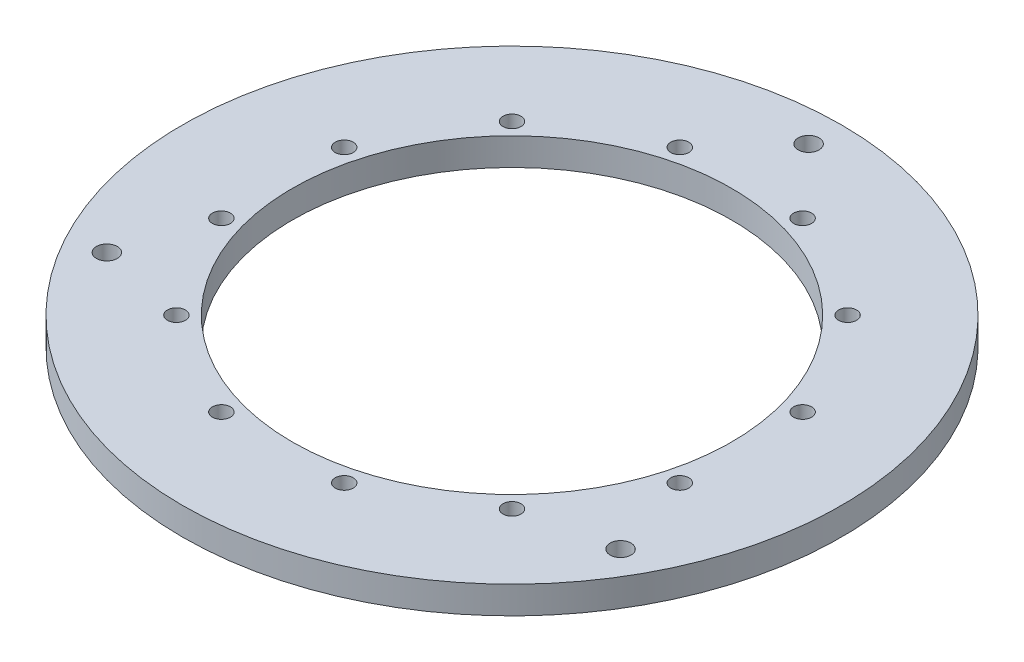
ISO-10303-21;
HEADER;
FILE_DESCRIPTION(('STEP AP214'),'2;1');
FILE_NAME('part.step','',(''),(''),'','','');
FILE_SCHEMA(('AUTOMOTIVE_DESIGN { 1 0 10303 214 1 1 1 1 }'));
ENDSEC;
DATA;
#1=APPLICATION_CONTEXT('core data for automotive mechanical design processes');
#2=APPLICATION_PROTOCOL_DEFINITION('international standard','automotive_design',2000,#1);
#3=PRODUCT_CONTEXT('',#1,'mechanical');
#4=PRODUCT('Part','Part','',(#3));
#5=PRODUCT_RELATED_PRODUCT_CATEGORY('part','',(#4));
#6=PRODUCT_DEFINITION_FORMATION('','',#4);
#7=PRODUCT_DEFINITION_CONTEXT('part definition',#1,'design');
#8=PRODUCT_DEFINITION('design','',#6,#7);
#9=PRODUCT_DEFINITION_SHAPE('','',#8);
#10=(LENGTH_UNIT() NAMED_UNIT(*) SI_UNIT(.MILLI.,.METRE.));
#11=(NAMED_UNIT(*) PLANE_ANGLE_UNIT() SI_UNIT($,.RADIAN.));
#12=(NAMED_UNIT(*) SI_UNIT($,.STERADIAN.) SOLID_ANGLE_UNIT());
#13=UNCERTAINTY_MEASURE_WITH_UNIT(LENGTH_MEASURE(1.E-05),#10,'distance_accuracy_value','');
#14=(GEOMETRIC_REPRESENTATION_CONTEXT(3) GLOBAL_UNCERTAINTY_ASSIGNED_CONTEXT((#13)) GLOBAL_UNIT_ASSIGNED_CONTEXT((#10,
#11,#12)) REPRESENTATION_CONTEXT('',''));
#15=CARTESIAN_POINT('',(0.,0.,0.));
#16=DIRECTION('',(0.,0.,1.));
#17=DIRECTION('',(1.,0.,0.));
#18=AXIS2_PLACEMENT_3D('',#15,#16,#17);
#19=CARTESIAN_POINT('',(0.,6.35,0.));
#20=DIRECTION('',(0.,-1.,0.));
#21=DIRECTION('',(0.,0.,-1.));
#22=AXIS2_PLACEMENT_3D('',#19,#20,#21);
#23=CYLINDRICAL_SURFACE('',#22,50.8);
#24=CARTESIAN_POINT('',(0.,6.35,0.));
#25=DIRECTION('',(0.,1.,0.));
#26=DIRECTION('',(0.,0.,1.));
#27=AXIS2_PLACEMENT_3D('',#24,#25,#26);
#28=CIRCLE('',#27,50.8);
#29=CARTESIAN_POINT('',(0.,6.35,50.8));
#30=VERTEX_POINT('',#29);
#31=EDGE_CURVE('E48',#30,#30,#28,.T.);
#32=ORIENTED_EDGE('',*,*,#31,.T.);
#33=EDGE_LOOP('',(#32));
#34=FACE_BOUND('',#33,.T.);
#35=CARTESIAN_POINT('',(0.,0.,0.));
#36=DIRECTION('',(0.,1.,0.));
#37=DIRECTION('',(0.,0.,1.));
#38=AXIS2_PLACEMENT_3D('',#35,#36,#37);
#39=CIRCLE('',#38,50.8);
#40=CARTESIAN_POINT('',(0.,0.,50.8));
#41=VERTEX_POINT('',#40);
#42=EDGE_CURVE('E117',#41,#41,#39,.T.);
#43=ORIENTED_EDGE('',*,*,#42,.F.);
#44=EDGE_LOOP('',(#43));
#45=FACE_BOUND('',#44,.T.);
#46=ADVANCED_FACE('F39',(#34,#45),#23,.F.);
#47=CARTESIAN_POINT('',(0.,6.35,-68.58));
#48=DIRECTION('',(0.,-1.,0.));
#49=DIRECTION('',(0.,0.,-1.));
#50=AXIS2_PLACEMENT_3D('',#47,#48,#49);
#51=CYLINDRICAL_SURFACE('',#50,2.41299999999999);
#52=CARTESIAN_POINT('',(0.,6.35,-68.58));
#53=DIRECTION('',(0.,1.,0.));
#54=DIRECTION('',(0.,0.,1.));
#55=AXIS2_PLACEMENT_3D('',#52,#53,#54);
#56=CIRCLE('',#55,2.41299999999999);
#57=CARTESIAN_POINT('',(0.,6.35,-66.167));
#58=VERTEX_POINT('',#57);
#59=EDGE_CURVE('E54',#58,#58,#56,.T.);
#60=ORIENTED_EDGE('',*,*,#59,.T.);
#61=EDGE_LOOP('',(#60));
#62=FACE_BOUND('',#61,.T.);
#63=CARTESIAN_POINT('',(0.,0.,-68.58));
#64=DIRECTION('',(0.,1.,0.));
#65=DIRECTION('',(0.,0.,1.));
#66=AXIS2_PLACEMENT_3D('',#63,#64,#65);
#67=CIRCLE('',#66,2.41299999999999);
#68=CARTESIAN_POINT('',(0.,0.,-66.167));
#69=VERTEX_POINT('',#68);
#70=EDGE_CURVE('E114',#69,#69,#67,.T.);
#71=ORIENTED_EDGE('',*,*,#70,.F.);
#72=EDGE_LOOP('',(#71));
#73=FACE_BOUND('',#72,.T.);
#74=ADVANCED_FACE('F188',(#62,#73),#51,.F.);
#75=CARTESIAN_POINT('',(59.3920221915368,6.35,34.29));
#76=DIRECTION('',(0.,-1.,0.));
#77=DIRECTION('',(0.,0.,-1.));
#78=AXIS2_PLACEMENT_3D('',#75,#76,#77);
#79=CYLINDRICAL_SURFACE('',#78,2.41299999999999);
#80=CARTESIAN_POINT('',(59.3920221915368,6.35,34.29));
#81=DIRECTION('',(0.,1.,0.));
#82=DIRECTION('',(0.,0.,1.));
#83=AXIS2_PLACEMENT_3D('',#80,#81,#82);
#84=CIRCLE('',#83,2.41299999999999);
#85=CARTESIAN_POINT('',(59.3920221915368,6.35,36.703));
#86=VERTEX_POINT('',#85);
#87=EDGE_CURVE('E181',#86,#86,#84,.T.);
#88=ORIENTED_EDGE('',*,*,#87,.T.);
#89=EDGE_LOOP('',(#88));
#90=FACE_BOUND('',#89,.T.);
#91=CARTESIAN_POINT('',(59.3920221915368,0.,34.29));
#92=DIRECTION('',(0.,1.,0.));
#93=DIRECTION('',(0.,0.,1.));
#94=AXIS2_PLACEMENT_3D('',#91,#92,#93);
#95=CIRCLE('',#94,2.41299999999999);
#96=CARTESIAN_POINT('',(59.3920221915368,0.,36.703));
#97=VERTEX_POINT('',#96);
#98=EDGE_CURVE('E110',#97,#97,#95,.T.);
#99=ORIENTED_EDGE('',*,*,#98,.F.);
#100=EDGE_LOOP('',(#99));
#101=FACE_BOUND('',#100,.T.);
#102=ADVANCED_FACE('F206',(#90,#101),#79,.F.);
#103=CARTESIAN_POINT('',(-59.3920221915368,6.35,34.29));
#104=DIRECTION('',(0.,-1.,0.));
#105=DIRECTION('',(0.,0.,-1.));
#106=AXIS2_PLACEMENT_3D('',#103,#104,#105);
#107=CYLINDRICAL_SURFACE('',#106,2.41299999999999);
#108=CARTESIAN_POINT('',(-59.3920221915368,6.35,34.29));
#109=DIRECTION('',(0.,1.,0.));
#110=DIRECTION('',(0.,0.,1.));
#111=AXIS2_PLACEMENT_3D('',#108,#109,#110);
#112=CIRCLE('',#111,2.41299999999999);
#113=CARTESIAN_POINT('',(-59.3920221915368,6.35,36.703));
#114=VERTEX_POINT('',#113);
#115=EDGE_CURVE('E177',#114,#114,#112,.T.);
#116=ORIENTED_EDGE('',*,*,#115,.T.);
#117=EDGE_LOOP('',(#116));
#118=FACE_BOUND('',#117,.T.);
#119=CARTESIAN_POINT('',(-59.3920221915368,0.,34.29));
#120=DIRECTION('',(0.,1.,0.));
#121=DIRECTION('',(0.,0.,1.));
#122=AXIS2_PLACEMENT_3D('',#119,#120,#121);
#123=CIRCLE('',#122,2.41299999999999);
#124=CARTESIAN_POINT('',(-59.3920221915368,0.,36.703));
#125=VERTEX_POINT('',#124);
#126=EDGE_CURVE('E106',#125,#125,#123,.T.);
#127=ORIENTED_EDGE('',*,*,#126,.F.);
#128=EDGE_LOOP('',(#127));
#129=FACE_BOUND('',#128,.T.);
#130=ADVANCED_FACE('F213',(#118,#129),#107,.F.);
#131=CARTESIAN_POINT('',(14.1998480905047,6.35,-52.9945545335234));
#132=DIRECTION('',(0.,-1.,0.));
#133=DIRECTION('',(0.,0.,-1.));
#134=AXIS2_PLACEMENT_3D('',#131,#132,#133);
#135=CYLINDRICAL_SURFACE('',#134,2.08280000000001);
#136=CARTESIAN_POINT('',(14.1998480905047,6.35,-52.9945545335234));
#137=DIRECTION('',(0.,1.,0.));
#138=DIRECTION('',(0.,0.,1.));
#139=AXIS2_PLACEMENT_3D('',#136,#137,#138);
#140=CIRCLE('',#139,2.08280000000001);
#141=CARTESIAN_POINT('',(14.1998480905047,6.35,-50.9117545335234));
#142=VERTEX_POINT('',#141);
#143=EDGE_CURVE('E173',#142,#142,#140,.T.);
#144=ORIENTED_EDGE('',*,*,#143,.T.);
#145=EDGE_LOOP('',(#144));
#146=FACE_BOUND('',#145,.T.);
#147=CARTESIAN_POINT('',(14.1998480905047,0.,-52.9945545335234));
#148=DIRECTION('',(0.,1.,0.));
#149=DIRECTION('',(0.,0.,1.));
#150=AXIS2_PLACEMENT_3D('',#147,#148,#149);
#151=CIRCLE('',#150,2.08280000000001);
#152=CARTESIAN_POINT('',(14.1998480905047,0.,-50.9117545335234));
#153=VERTEX_POINT('',#152);
#154=EDGE_CURVE('E102',#153,#153,#151,.T.);
#155=ORIENTED_EDGE('',*,*,#154,.F.);
#156=EDGE_LOOP('',(#155));
#157=FACE_BOUND('',#156,.T.);
#158=ADVANCED_FACE('F217',(#146,#157),#135,.F.);
#159=CARTESIAN_POINT('',(38.7947064430188,6.35,-38.7947064430187));
#160=DIRECTION('',(0.,-1.,0.));
#161=DIRECTION('',(0.,0.,-1.));
#162=AXIS2_PLACEMENT_3D('',#159,#160,#161);
#163=CYLINDRICAL_SURFACE('',#162,2.08280000000001);
#164=CARTESIAN_POINT('',(38.7947064430188,6.35,-38.7947064430187));
#165=DIRECTION('',(0.,1.,0.));
#166=DIRECTION('',(0.,0.,1.));
#167=AXIS2_PLACEMENT_3D('',#164,#165,#166);
#168=CIRCLE('',#167,2.08280000000001);
#169=CARTESIAN_POINT('',(38.7947064430188,6.35,-36.7119064430187));
#170=VERTEX_POINT('',#169);
#171=EDGE_CURVE('E169',#170,#170,#168,.T.);
#172=ORIENTED_EDGE('',*,*,#171,.T.);
#173=EDGE_LOOP('',(#172));
#174=FACE_BOUND('',#173,.T.);
#175=CARTESIAN_POINT('',(38.7947064430188,0.,-38.7947064430187));
#176=DIRECTION('',(0.,1.,0.));
#177=DIRECTION('',(0.,0.,1.));
#178=AXIS2_PLACEMENT_3D('',#175,#176,#177);
#179=CIRCLE('',#178,2.08280000000001);
#180=CARTESIAN_POINT('',(38.7947064430188,0.,-36.7119064430187));
#181=VERTEX_POINT('',#180);
#182=EDGE_CURVE('E98',#181,#181,#179,.T.);
#183=ORIENTED_EDGE('',*,*,#182,.F.);
#184=EDGE_LOOP('',(#183));
#185=FACE_BOUND('',#184,.T.);
#186=ADVANCED_FACE('F221',(#174,#185),#163,.F.);
#187=CARTESIAN_POINT('',(52.9945545335235,6.35,-14.1998480905045));
#188=DIRECTION('',(0.,-1.,0.));
#189=DIRECTION('',(0.,0.,-1.));
#190=AXIS2_PLACEMENT_3D('',#187,#188,#189);
#191=CYLINDRICAL_SURFACE('',#190,2.08280000000001);
#192=CARTESIAN_POINT('',(52.9945545335235,6.35,-14.1998480905045));
#193=DIRECTION('',(0.,1.,0.));
#194=DIRECTION('',(0.,0.,1.));
#195=AXIS2_PLACEMENT_3D('',#192,#193,#194);
#196=CIRCLE('',#195,2.08280000000001);
#197=CARTESIAN_POINT('',(52.9945545335235,6.35,-12.1170480905045));
#198=VERTEX_POINT('',#197);
#199=EDGE_CURVE('E165',#198,#198,#196,.T.);
#200=ORIENTED_EDGE('',*,*,#199,.T.);
#201=EDGE_LOOP('',(#200));
#202=FACE_BOUND('',#201,.T.);
#203=CARTESIAN_POINT('',(52.9945545335235,0.,-14.1998480905045));
#204=DIRECTION('',(0.,1.,0.));
#205=DIRECTION('',(0.,0.,1.));
#206=AXIS2_PLACEMENT_3D('',#203,#204,#205);
#207=CIRCLE('',#206,2.08280000000001);
#208=CARTESIAN_POINT('',(52.9945545335235,0.,-12.1170480905045));
#209=VERTEX_POINT('',#208);
#210=EDGE_CURVE('E94',#209,#209,#207,.T.);
#211=ORIENTED_EDGE('',*,*,#210,.F.);
#212=EDGE_LOOP('',(#211));
#213=FACE_BOUND('',#212,.T.);
#214=ADVANCED_FACE('F225',(#202,#213),#191,.F.);
#215=CARTESIAN_POINT('',(52.9945545335234,6.35,14.1998480905049));
#216=DIRECTION('',(0.,-1.,0.));
#217=DIRECTION('',(0.,0.,-1.));
#218=AXIS2_PLACEMENT_3D('',#215,#216,#217);
#219=CYLINDRICAL_SURFACE('',#218,2.08280000000001);
#220=CARTESIAN_POINT('',(52.9945545335234,6.35,14.1998480905049));
#221=DIRECTION('',(0.,1.,0.));
#222=DIRECTION('',(0.,0.,1.));
#223=AXIS2_PLACEMENT_3D('',#220,#221,#222);
#224=CIRCLE('',#223,2.08280000000001);
#225=CARTESIAN_POINT('',(52.9945545335234,6.35,16.2826480905049));
#226=VERTEX_POINT('',#225);
#227=EDGE_CURVE('E161',#226,#226,#224,.T.);
#228=ORIENTED_EDGE('',*,*,#227,.T.);
#229=EDGE_LOOP('',(#228));
#230=FACE_BOUND('',#229,.T.);
#231=CARTESIAN_POINT('',(52.9945545335234,0.,14.1998480905049));
#232=DIRECTION('',(0.,1.,0.));
#233=DIRECTION('',(0.,0.,1.));
#234=AXIS2_PLACEMENT_3D('',#231,#232,#233);
#235=CIRCLE('',#234,2.08280000000001);
#236=CARTESIAN_POINT('',(52.9945545335234,0.,16.2826480905049));
#237=VERTEX_POINT('',#236);
#238=EDGE_CURVE('E90',#237,#237,#235,.T.);
#239=ORIENTED_EDGE('',*,*,#238,.F.);
#240=EDGE_LOOP('',(#239));
#241=FACE_BOUND('',#240,.T.);
#242=ADVANCED_FACE('F229',(#230,#241),#219,.F.);
#243=CARTESIAN_POINT('',(38.7947064430185,6.35,38.794706443019));
#244=DIRECTION('',(0.,-1.,0.));
#245=DIRECTION('',(0.,0.,-1.));
#246=AXIS2_PLACEMENT_3D('',#243,#244,#245);
#247=CYLINDRICAL_SURFACE('',#246,2.0828);
#248=CARTESIAN_POINT('',(38.7947064430185,6.35,38.794706443019));
#249=DIRECTION('',(0.,1.,0.));
#250=DIRECTION('',(0.,0.,1.));
#251=AXIS2_PLACEMENT_3D('',#248,#249,#250);
#252=CIRCLE('',#251,2.0828);
#253=CARTESIAN_POINT('',(38.7947064430185,6.35,40.877506443019));
#254=VERTEX_POINT('',#253);
#255=EDGE_CURVE('E157',#254,#254,#252,.T.);
#256=ORIENTED_EDGE('',*,*,#255,.T.);
#257=EDGE_LOOP('',(#256));
#258=FACE_BOUND('',#257,.T.);
#259=CARTESIAN_POINT('',(38.7947064430185,0.,38.794706443019));
#260=DIRECTION('',(0.,1.,0.));
#261=DIRECTION('',(0.,0.,1.));
#262=AXIS2_PLACEMENT_3D('',#259,#260,#261);
#263=CIRCLE('',#262,2.0828);
#264=CARTESIAN_POINT('',(38.7947064430185,0.,40.877506443019));
#265=VERTEX_POINT('',#264);
#266=EDGE_CURVE('E86',#265,#265,#263,.T.);
#267=ORIENTED_EDGE('',*,*,#266,.F.);
#268=EDGE_LOOP('',(#267));
#269=FACE_BOUND('',#268,.T.);
#270=ADVANCED_FACE('F233',(#258,#269),#247,.F.);
#271=CARTESIAN_POINT('',(14.1998480905044,6.35,52.9945545335235));
#272=DIRECTION('',(0.,-1.,0.));
#273=DIRECTION('',(0.,0.,-1.));
#274=AXIS2_PLACEMENT_3D('',#271,#272,#273);
#275=CYLINDRICAL_SURFACE('',#274,2.08280000000001);
#276=CARTESIAN_POINT('',(14.1998480905044,6.35,52.9945545335235));
#277=DIRECTION('',(0.,1.,0.));
#278=DIRECTION('',(0.,0.,1.));
#279=AXIS2_PLACEMENT_3D('',#276,#277,#278);
#280=CIRCLE('',#279,2.08280000000001);
#281=CARTESIAN_POINT('',(14.1998480905044,6.35,55.0773545335236));
#282=VERTEX_POINT('',#281);
#283=EDGE_CURVE('E153',#282,#282,#280,.T.);
#284=ORIENTED_EDGE('',*,*,#283,.T.);
#285=EDGE_LOOP('',(#284));
#286=FACE_BOUND('',#285,.T.);
#287=CARTESIAN_POINT('',(14.1998480905044,0.,52.9945545335235));
#288=DIRECTION('',(0.,1.,0.));
#289=DIRECTION('',(0.,0.,1.));
#290=AXIS2_PLACEMENT_3D('',#287,#288,#289);
#291=CIRCLE('',#290,2.08280000000001);
#292=CARTESIAN_POINT('',(14.1998480905044,0.,55.0773545335236));
#293=VERTEX_POINT('',#292);
#294=EDGE_CURVE('E82',#293,#293,#291,.T.);
#295=ORIENTED_EDGE('',*,*,#294,.F.);
#296=EDGE_LOOP('',(#295));
#297=FACE_BOUND('',#296,.T.);
#298=ADVANCED_FACE('F237',(#286,#297),#275,.F.);
#299=CARTESIAN_POINT('',(-14.1998480905051,6.35,52.9945545335233));
#300=DIRECTION('',(0.,-1.,0.));
#301=DIRECTION('',(0.,0.,-1.));
#302=AXIS2_PLACEMENT_3D('',#299,#300,#301);
#303=CYLINDRICAL_SURFACE('',#302,2.08280000000001);
#304=CARTESIAN_POINT('',(-14.1998480905051,6.35,52.9945545335233));
#305=DIRECTION('',(0.,1.,0.));
#306=DIRECTION('',(0.,0.,1.));
#307=AXIS2_PLACEMENT_3D('',#304,#305,#306);
#308=CIRCLE('',#307,2.08280000000001);
#309=CARTESIAN_POINT('',(-14.1998480905051,6.35,55.0773545335234));
#310=VERTEX_POINT('',#309);
#311=EDGE_CURVE('E149',#310,#310,#308,.T.);
#312=ORIENTED_EDGE('',*,*,#311,.T.);
#313=EDGE_LOOP('',(#312));
#314=FACE_BOUND('',#313,.T.);
#315=CARTESIAN_POINT('',(-14.1998480905051,0.,52.9945545335233));
#316=DIRECTION('',(0.,1.,0.));
#317=DIRECTION('',(0.,0.,1.));
#318=AXIS2_PLACEMENT_3D('',#315,#316,#317);
#319=CIRCLE('',#318,2.08280000000001);
#320=CARTESIAN_POINT('',(-14.1998480905051,0.,55.0773545335234));
#321=VERTEX_POINT('',#320);
#322=EDGE_CURVE('E78',#321,#321,#319,.T.);
#323=ORIENTED_EDGE('',*,*,#322,.F.);
#324=EDGE_LOOP('',(#323));
#325=FACE_BOUND('',#324,.T.);
#326=ADVANCED_FACE('F241',(#314,#325),#303,.F.);
#327=CARTESIAN_POINT('',(-38.7947064430191,6.35,38.7947064430184));
#328=DIRECTION('',(0.,-1.,0.));
#329=DIRECTION('',(0.,0.,-1.));
#330=AXIS2_PLACEMENT_3D('',#327,#328,#329);
#331=CYLINDRICAL_SURFACE('',#330,2.08280000000001);
#332=CARTESIAN_POINT('',(-38.7947064430191,6.35,38.7947064430184));
#333=DIRECTION('',(0.,1.,0.));
#334=DIRECTION('',(0.,0.,1.));
#335=AXIS2_PLACEMENT_3D('',#332,#333,#334);
#336=CIRCLE('',#335,2.08280000000001);
#337=CARTESIAN_POINT('',(-38.7947064430191,6.35,40.8775064430184));
#338=VERTEX_POINT('',#337);
#339=EDGE_CURVE('E145',#338,#338,#336,.T.);
#340=ORIENTED_EDGE('',*,*,#339,.T.);
#341=EDGE_LOOP('',(#340));
#342=FACE_BOUND('',#341,.T.);
#343=CARTESIAN_POINT('',(-38.7947064430191,0.,38.7947064430184));
#344=DIRECTION('',(0.,1.,0.));
#345=DIRECTION('',(0.,0.,1.));
#346=AXIS2_PLACEMENT_3D('',#343,#344,#345);
#347=CIRCLE('',#346,2.08280000000001);
#348=CARTESIAN_POINT('',(-38.7947064430191,0.,40.8775064430184));
#349=VERTEX_POINT('',#348);
#350=EDGE_CURVE('E74',#349,#349,#347,.T.);
#351=ORIENTED_EDGE('',*,*,#350,.F.);
#352=EDGE_LOOP('',(#351));
#353=FACE_BOUND('',#352,.T.);
#354=ADVANCED_FACE('F245',(#342,#353),#331,.F.);
#355=CARTESIAN_POINT('',(-52.9945545335236,6.35,14.1998480905042));
#356=DIRECTION('',(0.,-1.,0.));
#357=DIRECTION('',(0.,0.,-1.));
#358=AXIS2_PLACEMENT_3D('',#355,#356,#357);
#359=CYLINDRICAL_SURFACE('',#358,2.08280000000001);
#360=CARTESIAN_POINT('',(-52.9945545335236,6.35,14.1998480905042));
#361=DIRECTION('',(0.,1.,0.));
#362=DIRECTION('',(0.,0.,1.));
#363=AXIS2_PLACEMENT_3D('',#360,#361,#362);
#364=CIRCLE('',#363,2.08280000000001);
#365=CARTESIAN_POINT('',(-52.9945545335236,6.35,16.2826480905042));
#366=VERTEX_POINT('',#365);
#367=EDGE_CURVE('E141',#366,#366,#364,.T.);
#368=ORIENTED_EDGE('',*,*,#367,.T.);
#369=EDGE_LOOP('',(#368));
#370=FACE_BOUND('',#369,.T.);
#371=CARTESIAN_POINT('',(-52.9945545335236,0.,14.1998480905042));
#372=DIRECTION('',(0.,1.,0.));
#373=DIRECTION('',(0.,0.,1.));
#374=AXIS2_PLACEMENT_3D('',#371,#372,#373);
#375=CIRCLE('',#374,2.08280000000001);
#376=CARTESIAN_POINT('',(-52.9945545335236,0.,16.2826480905042));
#377=VERTEX_POINT('',#376);
#378=EDGE_CURVE('E70',#377,#377,#375,.T.);
#379=ORIENTED_EDGE('',*,*,#378,.F.);
#380=EDGE_LOOP('',(#379));
#381=FACE_BOUND('',#380,.T.);
#382=ADVANCED_FACE('F249',(#370,#381),#359,.F.);
#383=CARTESIAN_POINT('',(-52.9945545335233,6.35,-14.1998480905053));
#384=DIRECTION('',(0.,-1.,0.));
#385=DIRECTION('',(0.,0.,-1.));
#386=AXIS2_PLACEMENT_3D('',#383,#384,#385);
#387=CYLINDRICAL_SURFACE('',#386,2.08280000000001);
#388=CARTESIAN_POINT('',(-52.9945545335233,6.35,-14.1998480905053));
#389=DIRECTION('',(0.,1.,0.));
#390=DIRECTION('',(0.,0.,1.));
#391=AXIS2_PLACEMENT_3D('',#388,#389,#390);
#392=CIRCLE('',#391,2.08280000000001);
#393=CARTESIAN_POINT('',(-52.9945545335233,6.35,-12.1170480905053));
#394=VERTEX_POINT('',#393);
#395=EDGE_CURVE('E135',#394,#394,#392,.T.);
#396=ORIENTED_EDGE('',*,*,#395,.T.);
#397=EDGE_LOOP('',(#396));
#398=FACE_BOUND('',#397,.T.);
#399=CARTESIAN_POINT('',(-52.9945545335233,0.,-14.1998480905053));
#400=DIRECTION('',(0.,1.,0.));
#401=DIRECTION('',(0.,0.,1.));
#402=AXIS2_PLACEMENT_3D('',#399,#400,#401);
#403=CIRCLE('',#402,2.08280000000001);
#404=CARTESIAN_POINT('',(-52.9945545335233,0.,-12.1170480905053));
#405=VERTEX_POINT('',#404);
#406=EDGE_CURVE('E66',#405,#405,#403,.T.);
#407=ORIENTED_EDGE('',*,*,#406,.F.);
#408=EDGE_LOOP('',(#407));
#409=FACE_BOUND('',#408,.T.);
#410=ADVANCED_FACE('F253',(#398,#409),#387,.F.);
#411=CARTESIAN_POINT('',(-38.7947064430183,6.35,-38.7947064430192));
#412=DIRECTION('',(0.,-1.,0.));
#413=DIRECTION('',(0.,0.,-1.));
#414=AXIS2_PLACEMENT_3D('',#411,#412,#413);
#415=CYLINDRICAL_SURFACE('',#414,2.08280000000001);
#416=CARTESIAN_POINT('',(-38.7947064430183,6.35,-38.7947064430192));
#417=DIRECTION('',(0.,1.,0.));
#418=DIRECTION('',(0.,0.,1.));
#419=AXIS2_PLACEMENT_3D('',#416,#417,#418);
#420=CIRCLE('',#419,2.08280000000001);
#421=CARTESIAN_POINT('',(-38.7947064430183,6.35,-36.7119064430192));
#422=VERTEX_POINT('',#421);
#423=EDGE_CURVE('E129',#422,#422,#420,.T.);
#424=ORIENTED_EDGE('',*,*,#423,.T.);
#425=EDGE_LOOP('',(#424));
#426=FACE_BOUND('',#425,.T.);
#427=CARTESIAN_POINT('',(-38.7947064430183,0.,-38.7947064430192));
#428=DIRECTION('',(0.,1.,0.));
#429=DIRECTION('',(0.,0.,1.));
#430=AXIS2_PLACEMENT_3D('',#427,#428,#429);
#431=CIRCLE('',#430,2.08280000000001);
#432=CARTESIAN_POINT('',(-38.7947064430183,0.,-36.7119064430192));
#433=VERTEX_POINT('',#432);
#434=EDGE_CURVE('E62',#433,#433,#431,.T.);
#435=ORIENTED_EDGE('',*,*,#434,.F.);
#436=EDGE_LOOP('',(#435));
#437=FACE_BOUND('',#436,.T.);
#438=ADVANCED_FACE('F256',(#426,#437),#415,.F.);
#439=CARTESIAN_POINT('',(-14.199848090504,6.35,-52.9945545335236));
#440=DIRECTION('',(0.,-1.,0.));
#441=DIRECTION('',(0.,0.,-1.));
#442=AXIS2_PLACEMENT_3D('',#439,#440,#441);
#443=CYLINDRICAL_SURFACE('',#442,2.08280000000001);
#444=CARTESIAN_POINT('',(-14.199848090504,6.35,-52.9945545335236));
#445=DIRECTION('',(0.,1.,0.));
#446=DIRECTION('',(0.,0.,1.));
#447=AXIS2_PLACEMENT_3D('',#444,#445,#446);
#448=CIRCLE('',#447,2.08280000000001);
#449=CARTESIAN_POINT('',(-14.199848090504,6.35,-50.9117545335236));
#450=VERTEX_POINT('',#449);
#451=EDGE_CURVE('E124',#450,#450,#448,.T.);
#452=ORIENTED_EDGE('',*,*,#451,.T.);
#453=EDGE_LOOP('',(#452));
#454=FACE_BOUND('',#453,.T.);
#455=CARTESIAN_POINT('',(-14.199848090504,0.,-52.9945545335236));
#456=DIRECTION('',(0.,1.,0.));
#457=DIRECTION('',(0.,0.,1.));
#458=AXIS2_PLACEMENT_3D('',#455,#456,#457);
#459=CIRCLE('',#458,2.08280000000001);
#460=CARTESIAN_POINT('',(-14.199848090504,0.,-50.9117545335236));
#461=VERTEX_POINT('',#460);
#462=EDGE_CURVE('E58',#461,#461,#459,.T.);
#463=ORIENTED_EDGE('',*,*,#462,.F.);
#464=EDGE_LOOP('',(#463));
#465=FACE_BOUND('',#464,.T.);
#466=ADVANCED_FACE('F41',(#454,#465),#443,.F.);
#467=CARTESIAN_POINT('',(0.,6.35,0.));
#468=DIRECTION('',(0.,-1.,0.));
#469=DIRECTION('',(0.,0.,-1.));
#470=AXIS2_PLACEMENT_3D('',#467,#468,#469);
#471=CYLINDRICAL_SURFACE('',#470,76.2);
#472=CARTESIAN_POINT('',(0.,6.35,0.));
#473=DIRECTION('',(0.,1.,0.));
#474=DIRECTION('',(0.,0.,1.));
#475=AXIS2_PLACEMENT_3D('',#472,#473,#474);
#476=CIRCLE('',#475,76.2);
#477=CARTESIAN_POINT('',(0.,6.35,76.2));
#478=VERTEX_POINT('',#477);
#479=EDGE_CURVE('E10',#478,#478,#476,.T.);
#480=ORIENTED_EDGE('',*,*,#479,.F.);
#481=EDGE_LOOP('',(#480));
#482=FACE_BOUND('',#481,.T.);
#483=CARTESIAN_POINT('',(0.,0.,0.));
#484=DIRECTION('',(0.,1.,0.));
#485=DIRECTION('',(0.,0.,1.));
#486=AXIS2_PLACEMENT_3D('',#483,#484,#485);
#487=CIRCLE('',#486,76.2);
#488=CARTESIAN_POINT('',(0.,0.,76.2));
#489=VERTEX_POINT('',#488);
#490=EDGE_CURVE('E43',#489,#489,#487,.T.);
#491=ORIENTED_EDGE('',*,*,#490,.T.);
#492=EDGE_LOOP('',(#491));
#493=FACE_BOUND('',#492,.T.);
#494=ADVANCED_FACE('F195',(#482,#493),#471,.T.);
#495=CARTESIAN_POINT('',(0.,6.35,0.));
#496=DIRECTION('',(0.,1.,0.));
#497=DIRECTION('',(0.,0.,1.));
#498=AXIS2_PLACEMENT_3D('',#495,#496,#497);
#499=PLANE('',#498);
#500=ORIENTED_EDGE('',*,*,#451,.F.);
#501=EDGE_LOOP('',(#500));
#502=FACE_BOUND('',#501,.T.);
#503=ORIENTED_EDGE('',*,*,#423,.F.);
#504=EDGE_LOOP('',(#503));
#505=FACE_BOUND('',#504,.T.);
#506=ORIENTED_EDGE('',*,*,#395,.F.);
#507=EDGE_LOOP('',(#506));
#508=FACE_BOUND('',#507,.T.);
#509=ORIENTED_EDGE('',*,*,#367,.F.);
#510=EDGE_LOOP('',(#509));
#511=FACE_BOUND('',#510,.T.);
#512=ORIENTED_EDGE('',*,*,#339,.F.);
#513=EDGE_LOOP('',(#512));
#514=FACE_BOUND('',#513,.T.);
#515=ORIENTED_EDGE('',*,*,#311,.F.);
#516=EDGE_LOOP('',(#515));
#517=FACE_BOUND('',#516,.T.);
#518=ORIENTED_EDGE('',*,*,#283,.F.);
#519=EDGE_LOOP('',(#518));
#520=FACE_BOUND('',#519,.T.);
#521=ORIENTED_EDGE('',*,*,#255,.F.);
#522=EDGE_LOOP('',(#521));
#523=FACE_BOUND('',#522,.T.);
#524=ORIENTED_EDGE('',*,*,#227,.F.);
#525=EDGE_LOOP('',(#524));
#526=FACE_BOUND('',#525,.T.);
#527=ORIENTED_EDGE('',*,*,#199,.F.);
#528=EDGE_LOOP('',(#527));
#529=FACE_BOUND('',#528,.T.);
#530=ORIENTED_EDGE('',*,*,#171,.F.);
#531=EDGE_LOOP('',(#530));
#532=FACE_BOUND('',#531,.T.);
#533=ORIENTED_EDGE('',*,*,#143,.F.);
#534=EDGE_LOOP('',(#533));
#535=FACE_BOUND('',#534,.T.);
#536=ORIENTED_EDGE('',*,*,#115,.F.);
#537=EDGE_LOOP('',(#536));
#538=FACE_BOUND('',#537,.T.);
#539=ORIENTED_EDGE('',*,*,#87,.F.);
#540=EDGE_LOOP('',(#539));
#541=FACE_BOUND('',#540,.T.);
#542=ORIENTED_EDGE('',*,*,#59,.F.);
#543=EDGE_LOOP('',(#542));
#544=FACE_BOUND('',#543,.T.);
#545=ORIENTED_EDGE('',*,*,#31,.F.);
#546=EDGE_LOOP('',(#545));
#547=FACE_BOUND('',#546,.T.);
#548=ORIENTED_EDGE('',*,*,#479,.T.);
#549=EDGE_LOOP('',(#548));
#550=FACE_BOUND('',#549,.T.);
#551=ADVANCED_FACE('F191',(#502,#505,#508,#511,#514,#517,#520,#523,#526,#529,#532,#535,#538,
#541,#544,#547,#550),#499,.T.);
#552=CARTESIAN_POINT('',(0.,0.,0.));
#553=DIRECTION('',(0.,1.,0.));
#554=DIRECTION('',(0.,0.,1.));
#555=AXIS2_PLACEMENT_3D('',#552,#553,#554);
#556=PLANE('',#555);
#557=ORIENTED_EDGE('',*,*,#462,.T.);
#558=EDGE_LOOP('',(#557));
#559=FACE_BOUND('',#558,.T.);
#560=ORIENTED_EDGE('',*,*,#434,.T.);
#561=EDGE_LOOP('',(#560));
#562=FACE_BOUND('',#561,.T.);
#563=ORIENTED_EDGE('',*,*,#406,.T.);
#564=EDGE_LOOP('',(#563));
#565=FACE_BOUND('',#564,.T.);
#566=ORIENTED_EDGE('',*,*,#378,.T.);
#567=EDGE_LOOP('',(#566));
#568=FACE_BOUND('',#567,.T.);
#569=ORIENTED_EDGE('',*,*,#350,.T.);
#570=EDGE_LOOP('',(#569));
#571=FACE_BOUND('',#570,.T.);
#572=ORIENTED_EDGE('',*,*,#322,.T.);
#573=EDGE_LOOP('',(#572));
#574=FACE_BOUND('',#573,.T.);
#575=ORIENTED_EDGE('',*,*,#294,.T.);
#576=EDGE_LOOP('',(#575));
#577=FACE_BOUND('',#576,.T.);
#578=ORIENTED_EDGE('',*,*,#266,.T.);
#579=EDGE_LOOP('',(#578));
#580=FACE_BOUND('',#579,.T.);
#581=ORIENTED_EDGE('',*,*,#238,.T.);
#582=EDGE_LOOP('',(#581));
#583=FACE_BOUND('',#582,.T.);
#584=ORIENTED_EDGE('',*,*,#210,.T.);
#585=EDGE_LOOP('',(#584));
#586=FACE_BOUND('',#585,.T.);
#587=ORIENTED_EDGE('',*,*,#182,.T.);
#588=EDGE_LOOP('',(#587));
#589=FACE_BOUND('',#588,.T.);
#590=ORIENTED_EDGE('',*,*,#154,.T.);
#591=EDGE_LOOP('',(#590));
#592=FACE_BOUND('',#591,.T.);
#593=ORIENTED_EDGE('',*,*,#126,.T.);
#594=EDGE_LOOP('',(#593));
#595=FACE_BOUND('',#594,.T.);
#596=ORIENTED_EDGE('',*,*,#98,.T.);
#597=EDGE_LOOP('',(#596));
#598=FACE_BOUND('',#597,.T.);
#599=ORIENTED_EDGE('',*,*,#70,.T.);
#600=EDGE_LOOP('',(#599));
#601=FACE_BOUND('',#600,.T.);
#602=ORIENTED_EDGE('',*,*,#42,.T.);
#603=EDGE_LOOP('',(#602));
#604=FACE_BOUND('',#603,.T.);
#605=ORIENTED_EDGE('',*,*,#490,.F.);
#606=EDGE_LOOP('',(#605));
#607=FACE_BOUND('',#606,.T.);
#608=ADVANCED_FACE('F194',(#559,#562,#565,#568,#571,#574,#577,#580,#583,#586,#589,#592,#595,
#598,#601,#604,#607),#556,.F.);
#609=CLOSED_SHELL('',(#46,#74,#102,#130,#158,#186,#214,#242,#270,#298,#326,#354,#382,#410,#438,
#466,#494,#551,#608));
#610=MANIFOLD_SOLID_BREP('B2',#609);
#611=ADVANCED_BREP_SHAPE_REPRESENTATION('',(#18,#610),#14);
#612=SHAPE_DEFINITION_REPRESENTATION(#9,#611);
ENDSEC;
END-ISO-10303-21;
